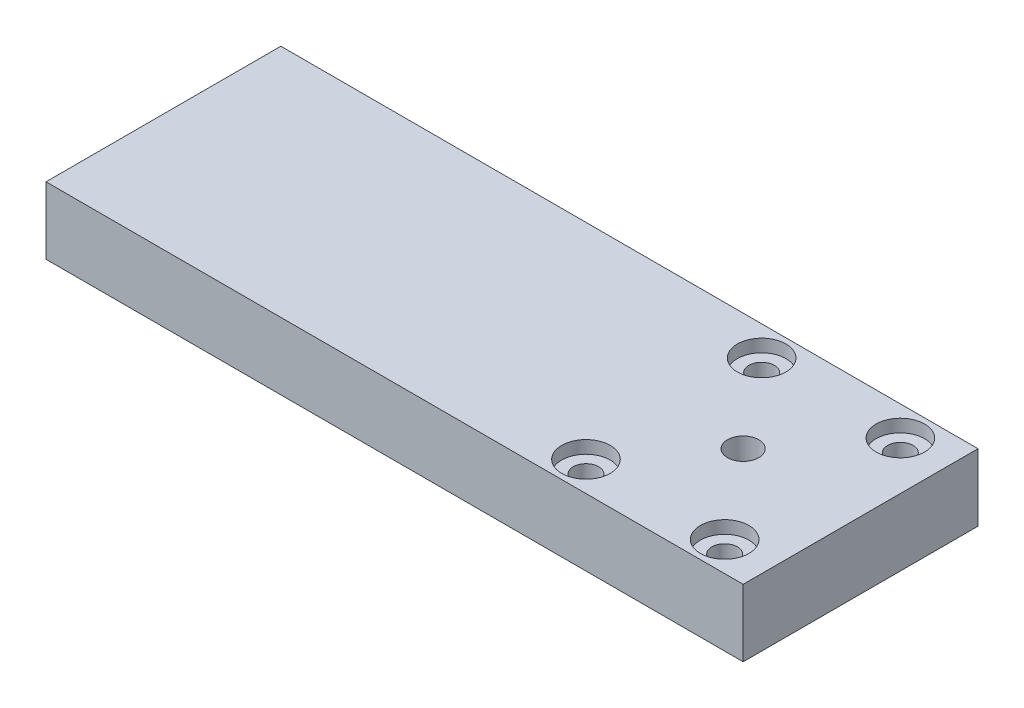
ISO-10303-21;
HEADER;
FILE_DESCRIPTION(('STEP AP214'),'2;1');
FILE_NAME('part.step','',(''),(''),'','','');
FILE_SCHEMA(('AUTOMOTIVE_DESIGN { 1 0 10303 214 1 1 1 1 }'));
ENDSEC;
DATA;
#1=APPLICATION_CONTEXT('core data for automotive mechanical design processes');
#2=APPLICATION_PROTOCOL_DEFINITION('international standard','automotive_design',2000,#1);
#3=PRODUCT_CONTEXT('',#1,'mechanical');
#4=PRODUCT('Part','Part','',(#3));
#5=PRODUCT_RELATED_PRODUCT_CATEGORY('part','',(#4));
#6=PRODUCT_DEFINITION_FORMATION('','',#4);
#7=PRODUCT_DEFINITION_CONTEXT('part definition',#1,'design');
#8=PRODUCT_DEFINITION('design','',#6,#7);
#9=PRODUCT_DEFINITION_SHAPE('','',#8);
#10=(LENGTH_UNIT() NAMED_UNIT(*) SI_UNIT(.MILLI.,.METRE.));
#11=(NAMED_UNIT(*) PLANE_ANGLE_UNIT() SI_UNIT($,.RADIAN.));
#12=(NAMED_UNIT(*) SI_UNIT($,.STERADIAN.) SOLID_ANGLE_UNIT());
#13=UNCERTAINTY_MEASURE_WITH_UNIT(LENGTH_MEASURE(1.E-05),#10,'distance_accuracy_value','');
#14=(GEOMETRIC_REPRESENTATION_CONTEXT(3) GLOBAL_UNCERTAINTY_ASSIGNED_CONTEXT((#13)) GLOBAL_UNIT_ASSIGNED_CONTEXT((#10,
#11,#12)) REPRESENTATION_CONTEXT('',''));
#15=CARTESIAN_POINT('',(0.,0.,0.));
#16=DIRECTION('',(0.,0.,1.));
#17=DIRECTION('',(1.,0.,0.));
#18=AXIS2_PLACEMENT_3D('',#15,#16,#17);
#19=CARTESIAN_POINT('',(25.4,7.26,25.4));
#20=DIRECTION('',(-1.,0.,0.));
#21=DIRECTION('',(0.,0.,1.));
#22=AXIS2_PLACEMENT_3D('',#19,#20,#21);
#23=PLANE('',#22);
#24=DIRECTION('',(0.,0.,-1.));
#25=VECTOR('',#24,1.);
#26=CARTESIAN_POINT('',(25.4,-7.26,25.4));
#27=LINE('',#26,#25);
#28=CARTESIAN_POINT('',(25.4,-7.26,25.4));
#29=VERTEX_POINT('',#28);
#30=CARTESIAN_POINT('',(25.4,-7.26,-25.4));
#31=VERTEX_POINT('',#30);
#32=EDGE_CURVE('E87',#29,#31,#27,.T.);
#33=ORIENTED_EDGE('',*,*,#32,.T.);
#34=DIRECTION('',(0.,-1.,0.));
#35=VECTOR('',#34,1.);
#36=CARTESIAN_POINT('',(25.4,7.26,-25.4));
#37=LINE('',#36,#35);
#38=CARTESIAN_POINT('',(25.4,7.26,-25.4));
#39=VERTEX_POINT('',#38);
#40=EDGE_CURVE('E11',#39,#31,#37,.T.);
#41=ORIENTED_EDGE('',*,*,#40,.F.);
#42=DIRECTION('',(0.,0.,-1.));
#43=VECTOR('',#42,1.);
#44=CARTESIAN_POINT('',(25.4,7.26,25.4));
#45=LINE('',#44,#43);
#46=CARTESIAN_POINT('',(25.4,7.26,25.4));
#47=VERTEX_POINT('',#46);
#48=EDGE_CURVE('E163',#47,#39,#45,.T.);
#49=ORIENTED_EDGE('',*,*,#48,.F.);
#50=DIRECTION('',(0.,-1.,0.));
#51=VECTOR('',#50,1.);
#52=CARTESIAN_POINT('',(25.4,7.26,25.4));
#53=LINE('',#52,#51);
#54=EDGE_CURVE('E47',#47,#29,#53,.T.);
#55=ORIENTED_EDGE('',*,*,#54,.T.);
#56=EDGE_LOOP('',(#33,#41,#49,#55));
#57=FACE_BOUND('',#56,.T.);
#58=ADVANCED_FACE('F39',(#57),#23,.F.);
#59=CARTESIAN_POINT('',(-25.4,7.26,-25.4));
#60=DIRECTION('',(0.,0.,1.));
#61=DIRECTION('',(1.,0.,0.));
#62=AXIS2_PLACEMENT_3D('',#59,#60,#61);
#63=PLANE('',#62);
#64=DIRECTION('',(-1.,0.,0.));
#65=VECTOR('',#64,1.);
#66=CARTESIAN_POINT('',(-25.4,-7.26,-25.4));
#67=LINE('',#66,#65);
#68=CARTESIAN_POINT('',(-125.4,-7.26,-25.4));
#69=VERTEX_POINT('',#68);
#70=EDGE_CURVE('E67',#31,#69,#67,.T.);
#71=ORIENTED_EDGE('',*,*,#70,.T.);
#72=DIRECTION('',(0.,-1.,0.));
#73=VECTOR('',#72,1.);
#74=CARTESIAN_POINT('',(-125.4,7.26,-25.4));
#75=LINE('',#74,#73);
#76=CARTESIAN_POINT('',(-125.4,7.26,-25.4));
#77=VERTEX_POINT('',#76);
#78=EDGE_CURVE('E83',#77,#69,#75,.T.);
#79=ORIENTED_EDGE('',*,*,#78,.F.);
#80=DIRECTION('',(-1.,0.,0.));
#81=VECTOR('',#80,1.);
#82=CARTESIAN_POINT('',(-25.4,7.26,-25.4));
#83=LINE('',#82,#81);
#84=EDGE_CURVE('E71',#39,#77,#83,.T.);
#85=ORIENTED_EDGE('',*,*,#84,.F.);
#86=ORIENTED_EDGE('',*,*,#40,.T.);
#87=EDGE_LOOP('',(#71,#79,#85,#86));
#88=FACE_BOUND('',#87,.T.);
#89=ADVANCED_FACE('F81',(#88),#63,.F.);
#90=CARTESIAN_POINT('',(-25.4,7.26,25.4));
#91=DIRECTION('',(0.,0.,-1.));
#92=DIRECTION('',(-1.,0.,0.));
#93=AXIS2_PLACEMENT_3D('',#90,#91,#92);
#94=PLANE('',#93);
#95=DIRECTION('',(1.,0.,0.));
#96=VECTOR('',#95,1.);
#97=CARTESIAN_POINT('',(-25.4,-7.26,25.4));
#98=LINE('',#97,#96);
#99=CARTESIAN_POINT('',(-125.4,-7.26,25.4));
#100=VERTEX_POINT('',#99);
#101=EDGE_CURVE('E86',#100,#29,#98,.T.);
#102=ORIENTED_EDGE('',*,*,#101,.T.);
#103=ORIENTED_EDGE('',*,*,#54,.F.);
#104=DIRECTION('',(1.,0.,0.));
#105=VECTOR('',#104,1.);
#106=CARTESIAN_POINT('',(-25.4,7.26,25.4));
#107=LINE('',#106,#105);
#108=CARTESIAN_POINT('',(-125.4,7.26,25.4));
#109=VERTEX_POINT('',#108);
#110=EDGE_CURVE('E55',#109,#47,#107,.T.);
#111=ORIENTED_EDGE('',*,*,#110,.F.);
#112=DIRECTION('',(0.,1.,0.));
#113=VECTOR('',#112,1.);
#114=CARTESIAN_POINT('',(-125.4,7.26,25.4));
#115=LINE('',#114,#113);
#116=EDGE_CURVE('E95',#100,#109,#115,.T.);
#117=ORIENTED_EDGE('',*,*,#116,.F.);
#118=EDGE_LOOP('',(#102,#103,#111,#117));
#119=FACE_BOUND('',#118,.T.);
#120=ADVANCED_FACE('F172',(#119),#94,.F.);
#121=CARTESIAN_POINT('',(0.,7.26,0.));
#122=DIRECTION('',(0.,-1.,0.));
#123=DIRECTION('',(0.,0.,-1.));
#124=AXIS2_PLACEMENT_3D('',#121,#122,#123);
#125=PLANE('',#124);
#126=CARTESIAN_POINT('',(0.,7.26,0.));
#127=DIRECTION('',(0.,-1.,0.));
#128=DIRECTION('',(0.,0.,-1.));
#129=AXIS2_PLACEMENT_3D('',#126,#127,#128);
#130=CIRCLE('',#129,3.3782);
#131=CARTESIAN_POINT('',(0.,7.26,-3.3782));
#132=VERTEX_POINT('',#131);
#133=EDGE_CURVE('E112',#132,#132,#130,.T.);
#134=ORIENTED_EDGE('',*,*,#133,.T.);
#135=EDGE_LOOP('',(#134));
#136=FACE_BOUND('',#135,.T.);
#137=CARTESIAN_POINT('',(-15.,7.26,-19.));
#138=DIRECTION('',(0.,1.,0.));
#139=DIRECTION('',(0.,0.,1.));
#140=AXIS2_PLACEMENT_3D('',#137,#138,#139);
#141=CIRCLE('',#140,5.25);
#142=CARTESIAN_POINT('',(-15.,7.26,-13.75));
#143=VERTEX_POINT('',#142);
#144=EDGE_CURVE('E115',#143,#143,#141,.T.);
#145=ORIENTED_EDGE('',*,*,#144,.F.);
#146=EDGE_LOOP('',(#145));
#147=FACE_BOUND('',#146,.T.);
#148=CARTESIAN_POINT('',(-15.,7.26,19.));
#149=DIRECTION('',(0.,1.,0.));
#150=DIRECTION('',(0.,0.,1.));
#151=AXIS2_PLACEMENT_3D('',#148,#149,#150);
#152=CIRCLE('',#151,5.25);
#153=CARTESIAN_POINT('',(-15.,7.26,24.25));
#154=VERTEX_POINT('',#153);
#155=EDGE_CURVE('E127',#154,#154,#152,.T.);
#156=ORIENTED_EDGE('',*,*,#155,.F.);
#157=EDGE_LOOP('',(#156));
#158=FACE_BOUND('',#157,.T.);
#159=CARTESIAN_POINT('',(15.,7.26,19.));
#160=DIRECTION('',(0.,1.,0.));
#161=DIRECTION('',(0.,0.,1.));
#162=AXIS2_PLACEMENT_3D('',#159,#160,#161);
#163=CIRCLE('',#162,5.25);
#164=CARTESIAN_POINT('',(15.,7.26,24.25));
#165=VERTEX_POINT('',#164);
#166=EDGE_CURVE('E139',#165,#165,#163,.T.);
#167=ORIENTED_EDGE('',*,*,#166,.F.);
#168=EDGE_LOOP('',(#167));
#169=FACE_BOUND('',#168,.T.);
#170=CARTESIAN_POINT('',(15.,7.26,-19.));
#171=DIRECTION('',(0.,1.,0.));
#172=DIRECTION('',(0.,0.,1.));
#173=AXIS2_PLACEMENT_3D('',#170,#171,#172);
#174=CIRCLE('',#173,5.25);
#175=CARTESIAN_POINT('',(15.,7.26,-13.75));
#176=VERTEX_POINT('',#175);
#177=EDGE_CURVE('E151',#176,#176,#174,.T.);
#178=ORIENTED_EDGE('',*,*,#177,.F.);
#179=EDGE_LOOP('',(#178));
#180=FACE_BOUND('',#179,.T.);
#181=ORIENTED_EDGE('',*,*,#48,.T.);
#182=ORIENTED_EDGE('',*,*,#84,.T.);
#183=DIRECTION('',(0.,0.,-1.));
#184=VECTOR('',#183,1.);
#185=CARTESIAN_POINT('',(-125.4,7.26,-25.4));
#186=LINE('',#185,#184);
#187=EDGE_CURVE('E98',#109,#77,#186,.T.);
#188=ORIENTED_EDGE('',*,*,#187,.F.);
#189=ORIENTED_EDGE('',*,*,#110,.T.);
#190=EDGE_LOOP('',(#181,#182,#188,#189));
#191=FACE_BOUND('',#190,.T.);
#192=ADVANCED_FACE('F173',(#136,#147,#158,#169,#180,#191),#125,.F.);
#193=CARTESIAN_POINT('',(0.,-7.26,0.));
#194=DIRECTION('',(0.,-1.,0.));
#195=DIRECTION('',(0.,0.,-1.));
#196=AXIS2_PLACEMENT_3D('',#193,#194,#195);
#197=PLANE('',#196);
#198=CARTESIAN_POINT('',(0.,-7.26,0.));
#199=DIRECTION('',(0.,-1.,0.));
#200=DIRECTION('',(0.,0.,-1.));
#201=AXIS2_PLACEMENT_3D('',#198,#199,#200);
#202=CIRCLE('',#201,5.55625);
#203=CARTESIAN_POINT('',(0.,-7.26,-5.55625));
#204=VERTEX_POINT('',#203);
#205=EDGE_CURVE('E103',#204,#204,#202,.T.);
#206=ORIENTED_EDGE('',*,*,#205,.F.);
#207=EDGE_LOOP('',(#206));
#208=FACE_BOUND('',#207,.T.);
#209=CARTESIAN_POINT('',(-15.,-7.26,-19.));
#210=DIRECTION('',(0.,-1.,0.));
#211=DIRECTION('',(0.,0.,-1.));
#212=AXIS2_PLACEMENT_3D('',#209,#210,#211);
#213=CIRCLE('',#212,2.75);
#214=CARTESIAN_POINT('',(-15.,-7.26,-21.75));
#215=VERTEX_POINT('',#214);
#216=EDGE_CURVE('E124',#215,#215,#213,.T.);
#217=ORIENTED_EDGE('',*,*,#216,.F.);
#218=EDGE_LOOP('',(#217));
#219=FACE_BOUND('',#218,.T.);
#220=CARTESIAN_POINT('',(-15.,-7.26,19.));
#221=DIRECTION('',(0.,-1.,0.));
#222=DIRECTION('',(0.,0.,-1.));
#223=AXIS2_PLACEMENT_3D('',#220,#221,#222);
#224=CIRCLE('',#223,2.75);
#225=CARTESIAN_POINT('',(-15.,-7.26,16.25));
#226=VERTEX_POINT('',#225);
#227=EDGE_CURVE('E136',#226,#226,#224,.T.);
#228=ORIENTED_EDGE('',*,*,#227,.F.);
#229=EDGE_LOOP('',(#228));
#230=FACE_BOUND('',#229,.T.);
#231=CARTESIAN_POINT('',(15.,-7.26,19.));
#232=DIRECTION('',(0.,-1.,0.));
#233=DIRECTION('',(0.,0.,-1.));
#234=AXIS2_PLACEMENT_3D('',#231,#232,#233);
#235=CIRCLE('',#234,2.75);
#236=CARTESIAN_POINT('',(15.,-7.26,16.25));
#237=VERTEX_POINT('',#236);
#238=EDGE_CURVE('E148',#237,#237,#235,.T.);
#239=ORIENTED_EDGE('',*,*,#238,.F.);
#240=EDGE_LOOP('',(#239));
#241=FACE_BOUND('',#240,.T.);
#242=CARTESIAN_POINT('',(15.,-7.26,-19.));
#243=DIRECTION('',(0.,-1.,0.));
#244=DIRECTION('',(0.,0.,-1.));
#245=AXIS2_PLACEMENT_3D('',#242,#243,#244);
#246=CIRCLE('',#245,2.75);
#247=CARTESIAN_POINT('',(15.,-7.26,-21.75));
#248=VERTEX_POINT('',#247);
#249=EDGE_CURVE('E160',#248,#248,#246,.T.);
#250=ORIENTED_EDGE('',*,*,#249,.F.);
#251=EDGE_LOOP('',(#250));
#252=FACE_BOUND('',#251,.T.);
#253=ORIENTED_EDGE('',*,*,#32,.F.);
#254=ORIENTED_EDGE('',*,*,#101,.F.);
#255=DIRECTION('',(0.,0.,1.));
#256=VECTOR('',#255,1.);
#257=CARTESIAN_POINT('',(-125.4,-7.26,-25.4));
#258=LINE('',#257,#256);
#259=EDGE_CURVE('E90',#69,#100,#258,.T.);
#260=ORIENTED_EDGE('',*,*,#259,.F.);
#261=ORIENTED_EDGE('',*,*,#70,.F.);
#262=EDGE_LOOP('',(#253,#254,#260,#261));
#263=FACE_BOUND('',#262,.T.);
#264=ADVANCED_FACE('F91',(#208,#219,#230,#241,#252,#263),#197,.T.);
#265=CARTESIAN_POINT('',(15.,7.26,-19.));
#266=DIRECTION('',(0.,1.,0.));
#267=DIRECTION('',(0.,0.,1.));
#268=AXIS2_PLACEMENT_3D('',#265,#266,#267);
#269=CYLINDRICAL_SURFACE('',#268,2.75);
#270=CARTESIAN_POINT('',(15.,4.51,-19.));
#271=DIRECTION('',(0.,1.,0.));
#272=DIRECTION('',(0.,0.,1.));
#273=AXIS2_PLACEMENT_3D('',#270,#271,#272);
#274=CIRCLE('',#273,2.75);
#275=CARTESIAN_POINT('',(15.,4.51,-16.25));
#276=VERTEX_POINT('',#275);
#277=EDGE_CURVE('E157',#276,#276,#274,.T.);
#278=ORIENTED_EDGE('',*,*,#277,.T.);
#279=EDGE_LOOP('',(#278));
#280=FACE_BOUND('',#279,.T.);
#281=ORIENTED_EDGE('',*,*,#249,.T.);
#282=EDGE_LOOP('',(#281));
#283=FACE_BOUND('',#282,.T.);
#284=ADVANCED_FACE('F181',(#280,#283),#269,.F.);
#285=CARTESIAN_POINT('',(17.75,4.51,-19.));
#286=DIRECTION('',(0.,-1.,0.));
#287=DIRECTION('',(0.,0.,-1.));
#288=AXIS2_PLACEMENT_3D('',#285,#286,#287);
#289=PLANE('',#288);
#290=ORIENTED_EDGE('',*,*,#277,.F.);
#291=EDGE_LOOP('',(#290));
#292=FACE_BOUND('',#291,.T.);
#293=CARTESIAN_POINT('',(15.,4.51,-19.));
#294=DIRECTION('',(0.,1.,0.));
#295=DIRECTION('',(0.,0.,1.));
#296=AXIS2_PLACEMENT_3D('',#293,#294,#295);
#297=CIRCLE('',#296,5.25);
#298=CARTESIAN_POINT('',(15.,4.51,-13.75));
#299=VERTEX_POINT('',#298);
#300=EDGE_CURVE('E154',#299,#299,#297,.T.);
#301=ORIENTED_EDGE('',*,*,#300,.T.);
#302=EDGE_LOOP('',(#301));
#303=FACE_BOUND('',#302,.T.);
#304=ADVANCED_FACE('F277',(#292,#303),#289,.F.);
#305=CARTESIAN_POINT('',(15.,7.26,-19.));
#306=DIRECTION('',(0.,1.,0.));
#307=DIRECTION('',(0.,0.,1.));
#308=AXIS2_PLACEMENT_3D('',#305,#306,#307);
#309=CYLINDRICAL_SURFACE('',#308,5.25);
#310=ORIENTED_EDGE('',*,*,#300,.F.);
#311=EDGE_LOOP('',(#310));
#312=FACE_BOUND('',#311,.T.);
#313=ORIENTED_EDGE('',*,*,#177,.T.);
#314=EDGE_LOOP('',(#313));
#315=FACE_BOUND('',#314,.T.);
#316=ADVANCED_FACE('F273',(#312,#315),#309,.F.);
#317=CARTESIAN_POINT('',(15.,7.26,19.));
#318=DIRECTION('',(0.,1.,0.));
#319=DIRECTION('',(0.,0.,1.));
#320=AXIS2_PLACEMENT_3D('',#317,#318,#319);
#321=CYLINDRICAL_SURFACE('',#320,2.75);
#322=CARTESIAN_POINT('',(15.,4.51,19.));
#323=DIRECTION('',(0.,1.,0.));
#324=DIRECTION('',(0.,0.,1.));
#325=AXIS2_PLACEMENT_3D('',#322,#323,#324);
#326=CIRCLE('',#325,2.75);
#327=CARTESIAN_POINT('',(15.,4.51,21.75));
#328=VERTEX_POINT('',#327);
#329=EDGE_CURVE('E145',#328,#328,#326,.T.);
#330=ORIENTED_EDGE('',*,*,#329,.T.);
#331=EDGE_LOOP('',(#330));
#332=FACE_BOUND('',#331,.T.);
#333=ORIENTED_EDGE('',*,*,#238,.T.);
#334=EDGE_LOOP('',(#333));
#335=FACE_BOUND('',#334,.T.);
#336=ADVANCED_FACE('F269',(#332,#335),#321,.F.);
#337=CARTESIAN_POINT('',(17.75,4.51,19.));
#338=DIRECTION('',(0.,-1.,0.));
#339=DIRECTION('',(0.,0.,-1.));
#340=AXIS2_PLACEMENT_3D('',#337,#338,#339);
#341=PLANE('',#340);
#342=ORIENTED_EDGE('',*,*,#329,.F.);
#343=EDGE_LOOP('',(#342));
#344=FACE_BOUND('',#343,.T.);
#345=CARTESIAN_POINT('',(15.,4.51,19.));
#346=DIRECTION('',(0.,1.,0.));
#347=DIRECTION('',(0.,0.,1.));
#348=AXIS2_PLACEMENT_3D('',#345,#346,#347);
#349=CIRCLE('',#348,5.25);
#350=CARTESIAN_POINT('',(15.,4.51,24.25));
#351=VERTEX_POINT('',#350);
#352=EDGE_CURVE('E142',#351,#351,#349,.T.);
#353=ORIENTED_EDGE('',*,*,#352,.T.);
#354=EDGE_LOOP('',(#353));
#355=FACE_BOUND('',#354,.T.);
#356=ADVANCED_FACE('F265',(#344,#355),#341,.F.);
#357=CARTESIAN_POINT('',(15.,7.26,19.));
#358=DIRECTION('',(0.,1.,0.));
#359=DIRECTION('',(0.,0.,1.));
#360=AXIS2_PLACEMENT_3D('',#357,#358,#359);
#361=CYLINDRICAL_SURFACE('',#360,5.25);
#362=ORIENTED_EDGE('',*,*,#352,.F.);
#363=EDGE_LOOP('',(#362));
#364=FACE_BOUND('',#363,.T.);
#365=ORIENTED_EDGE('',*,*,#166,.T.);
#366=EDGE_LOOP('',(#365));
#367=FACE_BOUND('',#366,.T.);
#368=ADVANCED_FACE('F261',(#364,#367),#361,.F.);
#369=CARTESIAN_POINT('',(-15.,7.26,19.));
#370=DIRECTION('',(0.,1.,0.));
#371=DIRECTION('',(0.,0.,1.));
#372=AXIS2_PLACEMENT_3D('',#369,#370,#371);
#373=CYLINDRICAL_SURFACE('',#372,2.75);
#374=CARTESIAN_POINT('',(-15.,4.51,19.));
#375=DIRECTION('',(0.,1.,0.));
#376=DIRECTION('',(0.,0.,1.));
#377=AXIS2_PLACEMENT_3D('',#374,#375,#376);
#378=CIRCLE('',#377,2.75);
#379=CARTESIAN_POINT('',(-15.,4.51,21.75));
#380=VERTEX_POINT('',#379);
#381=EDGE_CURVE('E133',#380,#380,#378,.T.);
#382=ORIENTED_EDGE('',*,*,#381,.T.);
#383=EDGE_LOOP('',(#382));
#384=FACE_BOUND('',#383,.T.);
#385=ORIENTED_EDGE('',*,*,#227,.T.);
#386=EDGE_LOOP('',(#385));
#387=FACE_BOUND('',#386,.T.);
#388=ADVANCED_FACE('F257',(#384,#387),#373,.F.);
#389=CARTESIAN_POINT('',(-12.25,4.51,19.));
#390=DIRECTION('',(0.,-1.,0.));
#391=DIRECTION('',(0.,0.,-1.));
#392=AXIS2_PLACEMENT_3D('',#389,#390,#391);
#393=PLANE('',#392);
#394=ORIENTED_EDGE('',*,*,#381,.F.);
#395=EDGE_LOOP('',(#394));
#396=FACE_BOUND('',#395,.T.);
#397=CARTESIAN_POINT('',(-15.,4.51,19.));
#398=DIRECTION('',(0.,1.,0.));
#399=DIRECTION('',(0.,0.,1.));
#400=AXIS2_PLACEMENT_3D('',#397,#398,#399);
#401=CIRCLE('',#400,5.25);
#402=CARTESIAN_POINT('',(-15.,4.51,24.25));
#403=VERTEX_POINT('',#402);
#404=EDGE_CURVE('E130',#403,#403,#401,.T.);
#405=ORIENTED_EDGE('',*,*,#404,.T.);
#406=EDGE_LOOP('',(#405));
#407=FACE_BOUND('',#406,.T.);
#408=ADVANCED_FACE('F253',(#396,#407),#393,.F.);
#409=CARTESIAN_POINT('',(-15.,7.26,19.));
#410=DIRECTION('',(0.,1.,0.));
#411=DIRECTION('',(0.,0.,1.));
#412=AXIS2_PLACEMENT_3D('',#409,#410,#411);
#413=CYLINDRICAL_SURFACE('',#412,5.25);
#414=ORIENTED_EDGE('',*,*,#404,.F.);
#415=EDGE_LOOP('',(#414));
#416=FACE_BOUND('',#415,.T.);
#417=ORIENTED_EDGE('',*,*,#155,.T.);
#418=EDGE_LOOP('',(#417));
#419=FACE_BOUND('',#418,.T.);
#420=ADVANCED_FACE('F249',(#416,#419),#413,.F.);
#421=CARTESIAN_POINT('',(-15.,7.26,-19.));
#422=DIRECTION('',(0.,1.,0.));
#423=DIRECTION('',(0.,0.,1.));
#424=AXIS2_PLACEMENT_3D('',#421,#422,#423);
#425=CYLINDRICAL_SURFACE('',#424,2.75);
#426=CARTESIAN_POINT('',(-15.,4.51,-19.));
#427=DIRECTION('',(0.,1.,0.));
#428=DIRECTION('',(0.,0.,1.));
#429=AXIS2_PLACEMENT_3D('',#426,#427,#428);
#430=CIRCLE('',#429,2.75);
#431=CARTESIAN_POINT('',(-15.,4.51,-16.25));
#432=VERTEX_POINT('',#431);
#433=EDGE_CURVE('E121',#432,#432,#430,.T.);
#434=ORIENTED_EDGE('',*,*,#433,.T.);
#435=EDGE_LOOP('',(#434));
#436=FACE_BOUND('',#435,.T.);
#437=ORIENTED_EDGE('',*,*,#216,.T.);
#438=EDGE_LOOP('',(#437));
#439=FACE_BOUND('',#438,.T.);
#440=ADVANCED_FACE('F245',(#436,#439),#425,.F.);
#441=CARTESIAN_POINT('',(-12.25,4.51,-19.));
#442=DIRECTION('',(0.,-1.,0.));
#443=DIRECTION('',(0.,0.,-1.));
#444=AXIS2_PLACEMENT_3D('',#441,#442,#443);
#445=PLANE('',#444);
#446=ORIENTED_EDGE('',*,*,#433,.F.);
#447=EDGE_LOOP('',(#446));
#448=FACE_BOUND('',#447,.T.);
#449=CARTESIAN_POINT('',(-15.,4.51,-19.));
#450=DIRECTION('',(0.,1.,0.));
#451=DIRECTION('',(0.,0.,1.));
#452=AXIS2_PLACEMENT_3D('',#449,#450,#451);
#453=CIRCLE('',#452,5.25);
#454=CARTESIAN_POINT('',(-15.,4.51,-13.75));
#455=VERTEX_POINT('',#454);
#456=EDGE_CURVE('E118',#455,#455,#453,.T.);
#457=ORIENTED_EDGE('',*,*,#456,.T.);
#458=EDGE_LOOP('',(#457));
#459=FACE_BOUND('',#458,.T.);
#460=ADVANCED_FACE('F241',(#448,#459),#445,.F.);
#461=CARTESIAN_POINT('',(-15.,7.26,-19.));
#462=DIRECTION('',(0.,1.,0.));
#463=DIRECTION('',(0.,0.,1.));
#464=AXIS2_PLACEMENT_3D('',#461,#462,#463);
#465=CYLINDRICAL_SURFACE('',#464,5.25);
#466=ORIENTED_EDGE('',*,*,#456,.F.);
#467=EDGE_LOOP('',(#466));
#468=FACE_BOUND('',#467,.T.);
#469=ORIENTED_EDGE('',*,*,#144,.T.);
#470=EDGE_LOOP('',(#469));
#471=FACE_BOUND('',#470,.T.);
#472=ADVANCED_FACE('F237',(#468,#471),#465,.F.);
#473=CARTESIAN_POINT('',(0.,-7.26,0.));
#474=DIRECTION('',(0.,-1.,0.));
#475=DIRECTION('',(0.,0.,-1.));
#476=AXIS2_PLACEMENT_3D('',#473,#474,#475);
#477=CYLINDRICAL_SURFACE('',#476,3.3782);
#478=ORIENTED_EDGE('',*,*,#133,.F.);
#479=EDGE_LOOP('',(#478));
#480=FACE_BOUND('',#479,.T.);
#481=CARTESIAN_POINT('',(0.,-0.91,0.));
#482=DIRECTION('',(0.,-1.,0.));
#483=DIRECTION('',(0.,0.,-1.));
#484=AXIS2_PLACEMENT_3D('',#481,#482,#483);
#485=CIRCLE('',#484,3.3782);
#486=CARTESIAN_POINT('',(0.,-0.91,-3.3782));
#487=VERTEX_POINT('',#486);
#488=EDGE_CURVE('E109',#487,#487,#485,.T.);
#489=ORIENTED_EDGE('',*,*,#488,.T.);
#490=EDGE_LOOP('',(#489));
#491=FACE_BOUND('',#490,.T.);
#492=ADVANCED_FACE('F233',(#480,#491),#477,.F.);
#493=CARTESIAN_POINT('',(3.3782,-0.91,0.));
#494=DIRECTION('',(0.,1.,0.));
#495=DIRECTION('',(0.,0.,1.));
#496=AXIS2_PLACEMENT_3D('',#493,#494,#495);
#497=PLANE('',#496);
#498=ORIENTED_EDGE('',*,*,#488,.F.);
#499=EDGE_LOOP('',(#498));
#500=FACE_BOUND('',#499,.T.);
#501=CARTESIAN_POINT('',(0.,-0.91,0.));
#502=DIRECTION('',(0.,-1.,0.));
#503=DIRECTION('',(0.,0.,-1.));
#504=AXIS2_PLACEMENT_3D('',#501,#502,#503);
#505=CIRCLE('',#504,5.55625);
#506=CARTESIAN_POINT('',(0.,-0.91,-5.55625));
#507=VERTEX_POINT('',#506);
#508=EDGE_CURVE('E106',#507,#507,#505,.T.);
#509=ORIENTED_EDGE('',*,*,#508,.T.);
#510=EDGE_LOOP('',(#509));
#511=FACE_BOUND('',#510,.T.);
#512=ADVANCED_FACE('F228',(#500,#511),#497,.F.);
#513=CARTESIAN_POINT('',(0.,-7.26,0.));
#514=DIRECTION('',(0.,-1.,0.));
#515=DIRECTION('',(0.,0.,-1.));
#516=AXIS2_PLACEMENT_3D('',#513,#514,#515);
#517=CYLINDRICAL_SURFACE('',#516,5.55625);
#518=ORIENTED_EDGE('',*,*,#508,.F.);
#519=EDGE_LOOP('',(#518));
#520=FACE_BOUND('',#519,.T.);
#521=ORIENTED_EDGE('',*,*,#205,.T.);
#522=EDGE_LOOP('',(#521));
#523=FACE_BOUND('',#522,.T.);
#524=ADVANCED_FACE('F199',(#520,#523),#517,.F.);
#525=CARTESIAN_POINT('',(-125.4,0.,0.));
#526=DIRECTION('',(-1.,0.,0.));
#527=DIRECTION('',(0.,0.,1.));
#528=AXIS2_PLACEMENT_3D('',#525,#526,#527);
#529=PLANE('',#528);
#530=ORIENTED_EDGE('',*,*,#78,.T.);
#531=ORIENTED_EDGE('',*,*,#259,.T.);
#532=ORIENTED_EDGE('',*,*,#116,.T.);
#533=ORIENTED_EDGE('',*,*,#187,.T.);
#534=EDGE_LOOP('',(#530,#531,#532,#533));
#535=FACE_BOUND('',#534,.T.);
#536=ADVANCED_FACE('F97',(#535),#529,.T.);
#537=CLOSED_SHELL('',(#58,#89,#120,#192,#264,#284,#304,#316,#336,#356,#368,#388,#408,#420,#440,
#460,#472,#492,#512,#524,#536));
#538=MANIFOLD_SOLID_BREP('B2',#537);
#539=ADVANCED_BREP_SHAPE_REPRESENTATION('',(#18,#538),#14);
#540=SHAPE_DEFINITION_REPRESENTATION(#9,#539);
ENDSEC;
END-ISO-10303-21;
